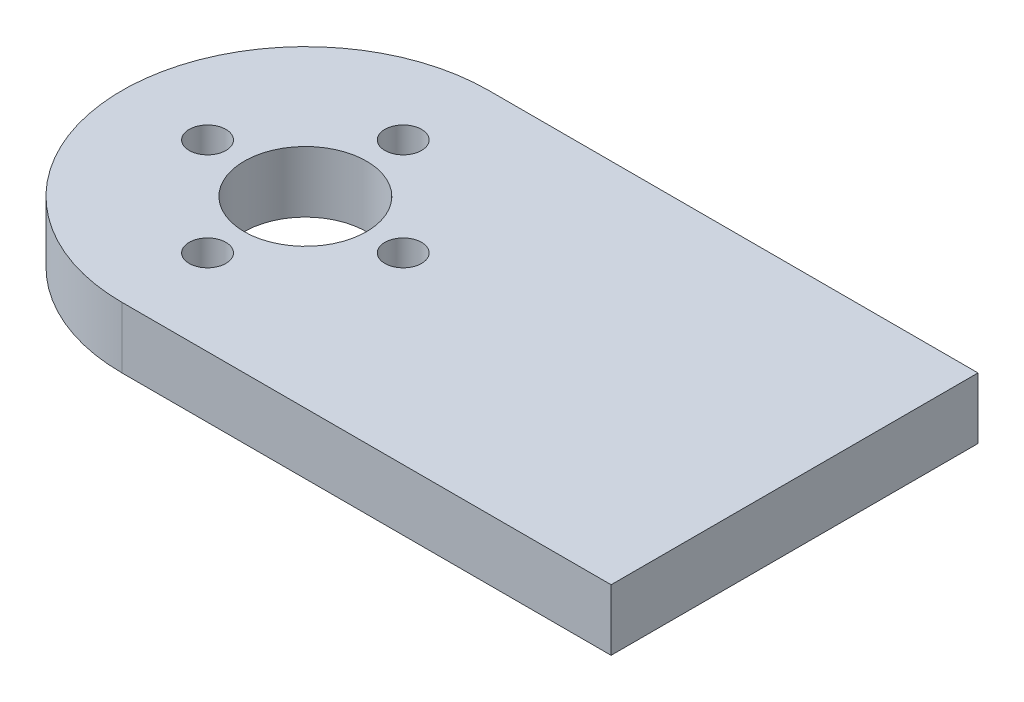
ISO-10303-21;
HEADER;
FILE_DESCRIPTION(('STEP AP214'),'2;1');
FILE_NAME('part.step','',(''),(''),'','','');
FILE_SCHEMA(('AUTOMOTIVE_DESIGN { 1 0 10303 214 1 1 1 1 }'));
ENDSEC;
DATA;
#1=APPLICATION_CONTEXT('core data for automotive mechanical design processes');
#2=APPLICATION_PROTOCOL_DEFINITION('international standard','automotive_design',2000,#1);
#3=PRODUCT_CONTEXT('',#1,'mechanical');
#4=PRODUCT('Part','Part','',(#3));
#5=PRODUCT_RELATED_PRODUCT_CATEGORY('part','',(#4));
#6=PRODUCT_DEFINITION_FORMATION('','',#4);
#7=PRODUCT_DEFINITION_CONTEXT('part definition',#1,'design');
#8=PRODUCT_DEFINITION('design','',#6,#7);
#9=PRODUCT_DEFINITION_SHAPE('','',#8);
#10=(LENGTH_UNIT() NAMED_UNIT(*) SI_UNIT(.MILLI.,.METRE.));
#11=(NAMED_UNIT(*) PLANE_ANGLE_UNIT() SI_UNIT($,.RADIAN.));
#12=(NAMED_UNIT(*) SI_UNIT($,.STERADIAN.) SOLID_ANGLE_UNIT());
#13=UNCERTAINTY_MEASURE_WITH_UNIT(LENGTH_MEASURE(1.E-05),#10,'distance_accuracy_value','');
#14=(GEOMETRIC_REPRESENTATION_CONTEXT(3) GLOBAL_UNCERTAINTY_ASSIGNED_CONTEXT((#13)) GLOBAL_UNIT_ASSIGNED_CONTEXT((#10,
#11,#12)) REPRESENTATION_CONTEXT('',''));
#15=CARTESIAN_POINT('',(0.,0.,0.));
#16=DIRECTION('',(0.,0.,1.));
#17=DIRECTION('',(1.,0.,0.));
#18=AXIS2_PLACEMENT_3D('',#15,#16,#17);
#19=CARTESIAN_POINT('',(0.,5.,0.));
#20=DIRECTION('',(0.,-1.,0.));
#21=DIRECTION('',(0.,0.,-1.));
#22=AXIS2_PLACEMENT_3D('',#19,#20,#21);
#23=CYLINDRICAL_SURFACE('',#22,15.);
#24=CARTESIAN_POINT('',(0.,0.,0.));
#25=DIRECTION('',(0.,1.,0.));
#26=DIRECTION('',(0.,0.,1.));
#27=AXIS2_PLACEMENT_3D('',#24,#25,#26);
#28=CIRCLE('',#27,15.);
#29=CARTESIAN_POINT('',(0.,0.,-15.));
#30=VERTEX_POINT('',#29);
#31=CARTESIAN_POINT('',(0.,0.,15.));
#32=VERTEX_POINT('',#31);
#33=EDGE_CURVE('E112',#30,#32,#28,.T.);
#34=ORIENTED_EDGE('',*,*,#33,.T.);
#35=DIRECTION('',(0.,-1.,0.));
#36=VECTOR('',#35,1.);
#37=CARTESIAN_POINT('',(0.,5.,15.));
#38=LINE('',#37,#36);
#39=CARTESIAN_POINT('',(0.,5.,15.));
#40=VERTEX_POINT('',#39);
#41=EDGE_CURVE('E11',#40,#32,#38,.T.);
#42=ORIENTED_EDGE('',*,*,#41,.F.);
#43=CARTESIAN_POINT('',(0.,5.,0.));
#44=DIRECTION('',(0.,1.,0.));
#45=DIRECTION('',(0.,0.,1.));
#46=AXIS2_PLACEMENT_3D('',#43,#44,#45);
#47=CIRCLE('',#46,15.);
#48=CARTESIAN_POINT('',(0.,5.,-15.));
#49=VERTEX_POINT('',#48);
#50=EDGE_CURVE('E83',#49,#40,#47,.T.);
#51=ORIENTED_EDGE('',*,*,#50,.F.);
#52=DIRECTION('',(0.,-1.,0.));
#53=VECTOR('',#52,1.);
#54=CARTESIAN_POINT('',(0.,5.,-15.));
#55=LINE('',#54,#53);
#56=EDGE_CURVE('E50',#49,#30,#55,.T.);
#57=ORIENTED_EDGE('',*,*,#56,.T.);
#58=EDGE_LOOP('',(#34,#42,#51,#57));
#59=FACE_BOUND('',#58,.T.);
#60=ADVANCED_FACE('F33',(#59),#23,.T.);
#61=CARTESIAN_POINT('',(0.,5.,15.));
#62=DIRECTION('',(0.,0.,-1.));
#63=DIRECTION('',(-1.,0.,0.));
#64=AXIS2_PLACEMENT_3D('',#61,#62,#63);
#65=PLANE('',#64);
#66=DIRECTION('',(1.,0.,0.));
#67=VECTOR('',#66,1.);
#68=CARTESIAN_POINT('',(0.,0.,15.));
#69=LINE('',#68,#67);
#70=CARTESIAN_POINT('',(40.,0.,15.));
#71=VERTEX_POINT('',#70);
#72=EDGE_CURVE('E88',#32,#71,#69,.T.);
#73=ORIENTED_EDGE('',*,*,#72,.T.);
#74=DIRECTION('',(0.,-1.,0.));
#75=VECTOR('',#74,1.);
#76=CARTESIAN_POINT('',(40.,5.,15.));
#77=LINE('',#76,#75);
#78=CARTESIAN_POINT('',(40.,5.,15.));
#79=VERTEX_POINT('',#78);
#80=EDGE_CURVE('E42',#79,#71,#77,.T.);
#81=ORIENTED_EDGE('',*,*,#80,.F.);
#82=DIRECTION('',(1.,0.,0.));
#83=VECTOR('',#82,1.);
#84=CARTESIAN_POINT('',(0.,5.,15.));
#85=LINE('',#84,#83);
#86=EDGE_CURVE('E75',#40,#79,#85,.T.);
#87=ORIENTED_EDGE('',*,*,#86,.F.);
#88=ORIENTED_EDGE('',*,*,#41,.T.);
#89=EDGE_LOOP('',(#73,#81,#87,#88));
#90=FACE_BOUND('',#89,.T.);
#91=ADVANCED_FACE('F87',(#90),#65,.F.);
#92=CARTESIAN_POINT('',(40.,5.,0.));
#93=DIRECTION('',(1.,0.,0.));
#94=DIRECTION('',(0.,0.,-1.));
#95=AXIS2_PLACEMENT_3D('',#92,#93,#94);
#96=PLANE('',#95);
#97=DIRECTION('',(0.,0.,1.));
#98=VECTOR('',#97,1.);
#99=CARTESIAN_POINT('',(40.,0.,0.));
#100=LINE('',#99,#98);
#101=CARTESIAN_POINT('',(40.,0.,-15.));
#102=VERTEX_POINT('',#101);
#103=EDGE_CURVE('E115',#102,#71,#100,.T.);
#104=ORIENTED_EDGE('',*,*,#103,.F.);
#105=DIRECTION('',(0.,-1.,0.));
#106=VECTOR('',#105,1.);
#107=CARTESIAN_POINT('',(40.,5.,-15.));
#108=LINE('',#107,#106);
#109=CARTESIAN_POINT('',(40.,5.,-15.));
#110=VERTEX_POINT('',#109);
#111=EDGE_CURVE('E64',#110,#102,#108,.T.);
#112=ORIENTED_EDGE('',*,*,#111,.F.);
#113=DIRECTION('',(0.,0.,1.));
#114=VECTOR('',#113,1.);
#115=CARTESIAN_POINT('',(40.,5.,0.));
#116=LINE('',#115,#114);
#117=EDGE_CURVE('E82',#110,#79,#116,.T.);
#118=ORIENTED_EDGE('',*,*,#117,.T.);
#119=ORIENTED_EDGE('',*,*,#80,.T.);
#120=EDGE_LOOP('',(#104,#112,#118,#119));
#121=FACE_BOUND('',#120,.T.);
#122=ADVANCED_FACE('F91',(#121),#96,.T.);
#123=CARTESIAN_POINT('',(0.,5.,0.));
#124=DIRECTION('',(0.,-1.,0.));
#125=DIRECTION('',(0.,0.,-1.));
#126=AXIS2_PLACEMENT_3D('',#123,#124,#125);
#127=CYLINDRICAL_SURFACE('',#126,5.);
#128=CARTESIAN_POINT('',(0.,5.,0.));
#129=DIRECTION('',(0.,1.,0.));
#130=DIRECTION('',(0.,0.,1.));
#131=AXIS2_PLACEMENT_3D('',#128,#129,#130);
#132=CIRCLE('',#131,5.);
#133=CARTESIAN_POINT('',(0.,5.,5.));
#134=VERTEX_POINT('',#133);
#135=EDGE_CURVE('E137',#134,#134,#132,.T.);
#136=ORIENTED_EDGE('',*,*,#135,.T.);
#137=EDGE_LOOP('',(#136));
#138=FACE_BOUND('',#137,.T.);
#139=CARTESIAN_POINT('',(0.,0.,0.));
#140=DIRECTION('',(0.,1.,0.));
#141=DIRECTION('',(0.,0.,1.));
#142=AXIS2_PLACEMENT_3D('',#139,#140,#141);
#143=CIRCLE('',#142,5.);
#144=CARTESIAN_POINT('',(0.,0.,5.));
#145=VERTEX_POINT('',#144);
#146=EDGE_CURVE('E109',#145,#145,#143,.T.);
#147=ORIENTED_EDGE('',*,*,#146,.F.);
#148=EDGE_LOOP('',(#147));
#149=FACE_BOUND('',#148,.T.);
#150=ADVANCED_FACE('F141',(#138,#149),#127,.F.);
#151=CARTESIAN_POINT('',(-8.,5.,0.));
#152=DIRECTION('',(0.,-1.,0.));
#153=DIRECTION('',(0.,0.,-1.));
#154=AXIS2_PLACEMENT_3D('',#151,#152,#153);
#155=CYLINDRICAL_SURFACE('',#154,1.50000000000008);
#156=CARTESIAN_POINT('',(-8.,5.,0.));
#157=DIRECTION('',(0.,1.,0.));
#158=DIRECTION('',(0.,0.,1.));
#159=AXIS2_PLACEMENT_3D('',#156,#157,#158);
#160=CIRCLE('',#159,1.50000000000008);
#161=CARTESIAN_POINT('',(-8.,5.,1.50000000000009));
#162=VERTEX_POINT('',#161);
#163=EDGE_CURVE('E134',#162,#162,#160,.T.);
#164=ORIENTED_EDGE('',*,*,#163,.T.);
#165=EDGE_LOOP('',(#164));
#166=FACE_BOUND('',#165,.T.);
#167=CARTESIAN_POINT('',(-8.,0.,0.));
#168=DIRECTION('',(0.,1.,0.));
#169=DIRECTION('',(0.,0.,1.));
#170=AXIS2_PLACEMENT_3D('',#167,#168,#169);
#171=CIRCLE('',#170,1.50000000000008);
#172=CARTESIAN_POINT('',(-8.,0.,1.50000000000009));
#173=VERTEX_POINT('',#172);
#174=EDGE_CURVE('E106',#173,#173,#171,.T.);
#175=ORIENTED_EDGE('',*,*,#174,.F.);
#176=EDGE_LOOP('',(#175));
#177=FACE_BOUND('',#176,.T.);
#178=ADVANCED_FACE('F167',(#166,#177),#155,.F.);
#179=CARTESIAN_POINT('',(0.,5.,8.));
#180=DIRECTION('',(0.,-1.,0.));
#181=DIRECTION('',(0.,0.,-1.));
#182=AXIS2_PLACEMENT_3D('',#179,#180,#181);
#183=CYLINDRICAL_SURFACE('',#182,1.50000000000006);
#184=CARTESIAN_POINT('',(0.,5.,8.));
#185=DIRECTION('',(0.,1.,0.));
#186=DIRECTION('',(0.,0.,1.));
#187=AXIS2_PLACEMENT_3D('',#184,#185,#186);
#188=CIRCLE('',#187,1.50000000000006);
#189=CARTESIAN_POINT('',(0.,5.,9.50000000000006));
#190=VERTEX_POINT('',#189);
#191=EDGE_CURVE('E129',#190,#190,#188,.T.);
#192=ORIENTED_EDGE('',*,*,#191,.T.);
#193=EDGE_LOOP('',(#192));
#194=FACE_BOUND('',#193,.T.);
#195=CARTESIAN_POINT('',(0.,0.,8.));
#196=DIRECTION('',(0.,1.,0.));
#197=DIRECTION('',(0.,0.,1.));
#198=AXIS2_PLACEMENT_3D('',#195,#196,#197);
#199=CIRCLE('',#198,1.50000000000006);
#200=CARTESIAN_POINT('',(0.,0.,9.50000000000006));
#201=VERTEX_POINT('',#200);
#202=EDGE_CURVE('E103',#201,#201,#199,.T.);
#203=ORIENTED_EDGE('',*,*,#202,.F.);
#204=EDGE_LOOP('',(#203));
#205=FACE_BOUND('',#204,.T.);
#206=ADVANCED_FACE('F170',(#194,#205),#183,.F.);
#207=CARTESIAN_POINT('',(8.,5.,0.));
#208=DIRECTION('',(0.,-1.,0.));
#209=DIRECTION('',(0.,0.,-1.));
#210=AXIS2_PLACEMENT_3D('',#207,#208,#209);
#211=CYLINDRICAL_SURFACE('',#210,1.50000000000003);
#212=CARTESIAN_POINT('',(8.,5.,0.));
#213=DIRECTION('',(0.,1.,0.));
#214=DIRECTION('',(0.,0.,1.));
#215=AXIS2_PLACEMENT_3D('',#212,#213,#214);
#216=CIRCLE('',#215,1.50000000000003);
#217=CARTESIAN_POINT('',(8.,5.,1.50000000000003));
#218=VERTEX_POINT('',#217);
#219=EDGE_CURVE('E124',#218,#218,#216,.T.);
#220=ORIENTED_EDGE('',*,*,#219,.T.);
#221=EDGE_LOOP('',(#220));
#222=FACE_BOUND('',#221,.T.);
#223=CARTESIAN_POINT('',(8.,0.,0.));
#224=DIRECTION('',(0.,1.,0.));
#225=DIRECTION('',(0.,0.,1.));
#226=AXIS2_PLACEMENT_3D('',#223,#224,#225);
#227=CIRCLE('',#226,1.50000000000003);
#228=CARTESIAN_POINT('',(8.,0.,1.50000000000003));
#229=VERTEX_POINT('',#228);
#230=EDGE_CURVE('E100',#229,#229,#227,.T.);
#231=ORIENTED_EDGE('',*,*,#230,.F.);
#232=EDGE_LOOP('',(#231));
#233=FACE_BOUND('',#232,.T.);
#234=ADVANCED_FACE('F173',(#222,#233),#211,.F.);
#235=CARTESIAN_POINT('',(0.,5.,-8.));
#236=DIRECTION('',(0.,-1.,0.));
#237=DIRECTION('',(0.,0.,-1.));
#238=AXIS2_PLACEMENT_3D('',#235,#236,#237);
#239=CYLINDRICAL_SURFACE('',#238,1.5);
#240=CARTESIAN_POINT('',(0.,5.,-8.));
#241=DIRECTION('',(0.,1.,0.));
#242=DIRECTION('',(0.,0.,1.));
#243=AXIS2_PLACEMENT_3D('',#240,#241,#242);
#244=CIRCLE('',#243,1.5);
#245=CARTESIAN_POINT('',(0.,5.,-6.5));
#246=VERTEX_POINT('',#245);
#247=EDGE_CURVE('E120',#246,#246,#244,.T.);
#248=ORIENTED_EDGE('',*,*,#247,.T.);
#249=EDGE_LOOP('',(#248));
#250=FACE_BOUND('',#249,.T.);
#251=CARTESIAN_POINT('',(0.,0.,-8.));
#252=DIRECTION('',(0.,1.,0.));
#253=DIRECTION('',(0.,0.,1.));
#254=AXIS2_PLACEMENT_3D('',#251,#252,#253);
#255=CIRCLE('',#254,1.5);
#256=CARTESIAN_POINT('',(0.,0.,-6.5));
#257=VERTEX_POINT('',#256);
#258=EDGE_CURVE('E97',#257,#257,#255,.T.);
#259=ORIENTED_EDGE('',*,*,#258,.F.);
#260=EDGE_LOOP('',(#259));
#261=FACE_BOUND('',#260,.T.);
#262=ADVANCED_FACE('F35',(#250,#261),#239,.F.);
#263=CARTESIAN_POINT('',(0.,5.,-15.));
#264=DIRECTION('',(0.,0.,-1.));
#265=DIRECTION('',(-1.,0.,0.));
#266=AXIS2_PLACEMENT_3D('',#263,#264,#265);
#267=PLANE('',#266);
#268=DIRECTION('',(1.,0.,0.));
#269=VECTOR('',#268,1.);
#270=CARTESIAN_POINT('',(0.,0.,-15.));
#271=LINE('',#270,#269);
#272=EDGE_CURVE('E117',#30,#102,#271,.T.);
#273=ORIENTED_EDGE('',*,*,#272,.F.);
#274=ORIENTED_EDGE('',*,*,#56,.F.);
#275=DIRECTION('',(1.,0.,0.));
#276=VECTOR('',#275,1.);
#277=CARTESIAN_POINT('',(0.,5.,-15.));
#278=LINE('',#277,#276);
#279=EDGE_CURVE('E92',#49,#110,#278,.T.);
#280=ORIENTED_EDGE('',*,*,#279,.T.);
#281=ORIENTED_EDGE('',*,*,#111,.T.);
#282=EDGE_LOOP('',(#273,#274,#280,#281));
#283=FACE_BOUND('',#282,.T.);
#284=ADVANCED_FACE('F146',(#283),#267,.T.);
#285=CARTESIAN_POINT('',(0.,5.,0.));
#286=DIRECTION('',(0.,1.,0.));
#287=DIRECTION('',(0.,0.,1.));
#288=AXIS2_PLACEMENT_3D('',#285,#286,#287);
#289=PLANE('',#288);
#290=ORIENTED_EDGE('',*,*,#247,.F.);
#291=EDGE_LOOP('',(#290));
#292=FACE_BOUND('',#291,.T.);
#293=ORIENTED_EDGE('',*,*,#219,.F.);
#294=EDGE_LOOP('',(#293));
#295=FACE_BOUND('',#294,.T.);
#296=ORIENTED_EDGE('',*,*,#191,.F.);
#297=EDGE_LOOP('',(#296));
#298=FACE_BOUND('',#297,.T.);
#299=ORIENTED_EDGE('',*,*,#163,.F.);
#300=EDGE_LOOP('',(#299));
#301=FACE_BOUND('',#300,.T.);
#302=ORIENTED_EDGE('',*,*,#135,.F.);
#303=EDGE_LOOP('',(#302));
#304=FACE_BOUND('',#303,.T.);
#305=ORIENTED_EDGE('',*,*,#50,.T.);
#306=ORIENTED_EDGE('',*,*,#86,.T.);
#307=ORIENTED_EDGE('',*,*,#117,.F.);
#308=ORIENTED_EDGE('',*,*,#279,.F.);
#309=EDGE_LOOP('',(#305,#306,#307,#308));
#310=FACE_BOUND('',#309,.T.);
#311=ADVANCED_FACE('F79',(#292,#295,#298,#301,#304,#310),#289,.T.);
#312=CARTESIAN_POINT('',(0.,0.,0.));
#313=DIRECTION('',(0.,1.,0.));
#314=DIRECTION('',(0.,0.,1.));
#315=AXIS2_PLACEMENT_3D('',#312,#313,#314);
#316=PLANE('',#315);
#317=ORIENTED_EDGE('',*,*,#258,.T.);
#318=EDGE_LOOP('',(#317));
#319=FACE_BOUND('',#318,.T.);
#320=ORIENTED_EDGE('',*,*,#230,.T.);
#321=EDGE_LOOP('',(#320));
#322=FACE_BOUND('',#321,.T.);
#323=ORIENTED_EDGE('',*,*,#202,.T.);
#324=EDGE_LOOP('',(#323));
#325=FACE_BOUND('',#324,.T.);
#326=ORIENTED_EDGE('',*,*,#174,.T.);
#327=EDGE_LOOP('',(#326));
#328=FACE_BOUND('',#327,.T.);
#329=ORIENTED_EDGE('',*,*,#146,.T.);
#330=EDGE_LOOP('',(#329));
#331=FACE_BOUND('',#330,.T.);
#332=ORIENTED_EDGE('',*,*,#33,.F.);
#333=ORIENTED_EDGE('',*,*,#272,.T.);
#334=ORIENTED_EDGE('',*,*,#103,.T.);
#335=ORIENTED_EDGE('',*,*,#72,.F.);
#336=EDGE_LOOP('',(#332,#333,#334,#335));
#337=FACE_BOUND('',#336,.T.);
#338=ADVANCED_FACE('F145',(#319,#322,#325,#328,#331,#337),#316,.F.);
#339=CLOSED_SHELL('',(#60,#91,#122,#150,#178,#206,#234,#262,#284,#311,#338));
#340=MANIFOLD_SOLID_BREP('B2',#339);
#341=ADVANCED_BREP_SHAPE_REPRESENTATION('',(#18,#340),#14);
#342=SHAPE_DEFINITION_REPRESENTATION(#9,#341);
ENDSEC;
END-ISO-10303-21;
